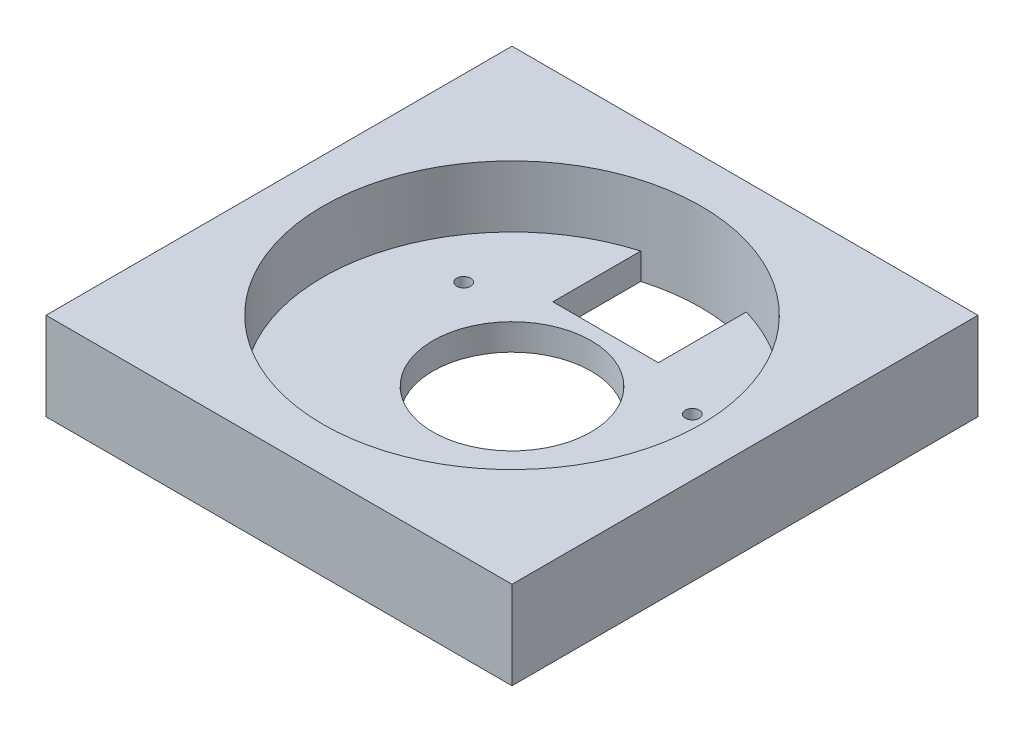
ISO-10303-21;
HEADER;
FILE_DESCRIPTION(('STEP AP214'),'2;1');
FILE_NAME('part.step','',(''),(''),'','','');
FILE_SCHEMA(('AUTOMOTIVE_DESIGN { 1 0 10303 214 1 1 1 1 }'));
ENDSEC;
DATA;
#1=APPLICATION_CONTEXT('core data for automotive mechanical design processes');
#2=APPLICATION_PROTOCOL_DEFINITION('international standard','automotive_design',2000,#1);
#3=PRODUCT_CONTEXT('',#1,'mechanical');
#4=PRODUCT('Part','Part','',(#3));
#5=PRODUCT_RELATED_PRODUCT_CATEGORY('part','',(#4));
#6=PRODUCT_DEFINITION_FORMATION('','',#4);
#7=PRODUCT_DEFINITION_CONTEXT('part definition',#1,'design');
#8=PRODUCT_DEFINITION('design','',#6,#7);
#9=PRODUCT_DEFINITION_SHAPE('','',#8);
#10=(LENGTH_UNIT() NAMED_UNIT(*) SI_UNIT(.MILLI.,.METRE.));
#11=(NAMED_UNIT(*) PLANE_ANGLE_UNIT() SI_UNIT($,.RADIAN.));
#12=(NAMED_UNIT(*) SI_UNIT($,.STERADIAN.) SOLID_ANGLE_UNIT());
#13=UNCERTAINTY_MEASURE_WITH_UNIT(LENGTH_MEASURE(1.E-05),#10,'distance_accuracy_value','');
#14=(GEOMETRIC_REPRESENTATION_CONTEXT(3) GLOBAL_UNCERTAINTY_ASSIGNED_CONTEXT((#13)) GLOBAL_UNIT_ASSIGNED_CONTEXT((#10,
#11,#12)) REPRESENTATION_CONTEXT('',''));
#15=CARTESIAN_POINT('',(0.,0.,0.));
#16=DIRECTION('',(0.,0.,1.));
#17=DIRECTION('',(1.,0.,0.));
#18=AXIS2_PLACEMENT_3D('',#15,#16,#17);
#19=CARTESIAN_POINT('',(0.,7.,0.));
#20=DIRECTION('',(0.,1.,0.));
#21=DIRECTION('',(0.,0.,1.));
#22=AXIS2_PLACEMENT_3D('',#19,#20,#21);
#23=PLANE('',#22);
#24=DIRECTION('',(0.,0.,-1.));
#25=VECTOR('',#24,1.);
#26=CARTESIAN_POINT('',(26.5,7.,-26.5));
#27=LINE('',#26,#25);
#28=CARTESIAN_POINT('',(26.5,7.,26.5));
#29=VERTEX_POINT('',#28);
#30=CARTESIAN_POINT('',(26.5,7.,-26.5));
#31=VERTEX_POINT('',#30);
#32=EDGE_CURVE('E205',#29,#31,#27,.T.);
#33=ORIENTED_EDGE('',*,*,#32,.T.);
#34=DIRECTION('',(-1.,0.,0.));
#35=VECTOR('',#34,1.);
#36=CARTESIAN_POINT('',(-26.5,7.,-26.5));
#37=LINE('',#36,#35);
#38=CARTESIAN_POINT('',(-26.5,7.,-26.5));
#39=VERTEX_POINT('',#38);
#40=EDGE_CURVE('E210',#31,#39,#37,.T.);
#41=ORIENTED_EDGE('',*,*,#40,.T.);
#42=DIRECTION('',(0.,0.,1.));
#43=VECTOR('',#42,1.);
#44=CARTESIAN_POINT('',(-26.5,7.,-26.5));
#45=LINE('',#44,#43);
#46=CARTESIAN_POINT('',(-26.5,7.,26.5));
#47=VERTEX_POINT('',#46);
#48=EDGE_CURVE('E213',#39,#47,#45,.T.);
#49=ORIENTED_EDGE('',*,*,#48,.T.);
#50=DIRECTION('',(1.,0.,0.));
#51=VECTOR('',#50,1.);
#52=CARTESIAN_POINT('',(-26.5,7.,26.5));
#53=LINE('',#52,#51);
#54=EDGE_CURVE('E63',#47,#29,#53,.T.);
#55=ORIENTED_EDGE('',*,*,#54,.T.);
#56=EDGE_LOOP('',(#33,#41,#49,#55));
#57=FACE_BOUND('',#56,.T.);
#58=CARTESIAN_POINT('',(0.,7.,0.));
#59=DIRECTION('',(0.,1.,0.));
#60=DIRECTION('',(0.,0.,1.));
#61=AXIS2_PLACEMENT_3D('',#58,#59,#60);
#62=CIRCLE('',#61,21.5);
#63=CARTESIAN_POINT('',(0.,7.,21.5));
#64=VERTEX_POINT('',#63);
#65=EDGE_CURVE('E201',#64,#64,#62,.T.);
#66=ORIENTED_EDGE('',*,*,#65,.F.);
#67=EDGE_LOOP('',(#66));
#68=FACE_BOUND('',#67,.T.);
#69=ADVANCED_FACE('F39',(#57,#68),#23,.T.);
#70=CARTESIAN_POINT('',(26.5,7.,-26.5));
#71=DIRECTION('',(-1.,0.,0.));
#72=DIRECTION('',(0.,0.,1.));
#73=AXIS2_PLACEMENT_3D('',#70,#71,#72);
#74=PLANE('',#73);
#75=DIRECTION('',(0.,-1.,0.));
#76=VECTOR('',#75,1.);
#77=CARTESIAN_POINT('',(26.5,7.,26.5));
#78=LINE('',#77,#76);
#79=CARTESIAN_POINT('',(26.5,-3.,26.5));
#80=VERTEX_POINT('',#79);
#81=EDGE_CURVE('E218',#29,#80,#78,.T.);
#82=ORIENTED_EDGE('',*,*,#81,.T.);
#83=DIRECTION('',(0.,0.,1.));
#84=VECTOR('',#83,1.);
#85=CARTESIAN_POINT('',(26.5,-3.,26.5));
#86=LINE('',#85,#84);
#87=CARTESIAN_POINT('',(26.5,-3.,-26.5));
#88=VERTEX_POINT('',#87);
#89=EDGE_CURVE('E193',#88,#80,#86,.T.);
#90=ORIENTED_EDGE('',*,*,#89,.F.);
#91=DIRECTION('',(0.,-1.,0.));
#92=VECTOR('',#91,1.);
#93=CARTESIAN_POINT('',(26.5,7.,-26.5));
#94=LINE('',#93,#92);
#95=EDGE_CURVE('E11',#31,#88,#94,.T.);
#96=ORIENTED_EDGE('',*,*,#95,.F.);
#97=ORIENTED_EDGE('',*,*,#32,.F.);
#98=EDGE_LOOP('',(#82,#90,#96,#97));
#99=FACE_BOUND('',#98,.T.);
#100=ADVANCED_FACE('F41',(#99),#74,.F.);
#101=CARTESIAN_POINT('',(-26.5,7.,-26.5));
#102=DIRECTION('',(0.,0.,1.));
#103=DIRECTION('',(1.,0.,0.));
#104=AXIS2_PLACEMENT_3D('',#101,#102,#103);
#105=PLANE('',#104);
#106=ORIENTED_EDGE('',*,*,#95,.T.);
#107=DIRECTION('',(1.,0.,0.));
#108=VECTOR('',#107,1.);
#109=CARTESIAN_POINT('',(-26.5,-3.,-26.5));
#110=LINE('',#109,#108);
#111=CARTESIAN_POINT('',(-26.5,-3.,-26.5));
#112=VERTEX_POINT('',#111);
#113=EDGE_CURVE('E189',#112,#88,#110,.T.);
#114=ORIENTED_EDGE('',*,*,#113,.F.);
#115=DIRECTION('',(0.,-1.,0.));
#116=VECTOR('',#115,1.);
#117=CARTESIAN_POINT('',(-26.5,7.,-26.5));
#118=LINE('',#117,#116);
#119=EDGE_CURVE('E48',#39,#112,#118,.T.);
#120=ORIENTED_EDGE('',*,*,#119,.F.);
#121=ORIENTED_EDGE('',*,*,#40,.F.);
#122=EDGE_LOOP('',(#106,#114,#120,#121));
#123=FACE_BOUND('',#122,.T.);
#124=ADVANCED_FACE('F232',(#123),#105,.F.);
#125=CARTESIAN_POINT('',(-26.5,7.,-26.5));
#126=DIRECTION('',(1.,0.,0.));
#127=DIRECTION('',(0.,0.,-1.));
#128=AXIS2_PLACEMENT_3D('',#125,#126,#127);
#129=PLANE('',#128);
#130=ORIENTED_EDGE('',*,*,#119,.T.);
#131=DIRECTION('',(0.,0.,-1.));
#132=VECTOR('',#131,1.);
#133=CARTESIAN_POINT('',(-26.5,-3.,26.5));
#134=LINE('',#133,#132);
#135=CARTESIAN_POINT('',(-26.5,-3.,26.5));
#136=VERTEX_POINT('',#135);
#137=EDGE_CURVE('E182',#136,#112,#134,.T.);
#138=ORIENTED_EDGE('',*,*,#137,.F.);
#139=DIRECTION('',(0.,-1.,0.));
#140=VECTOR('',#139,1.);
#141=CARTESIAN_POINT('',(-26.5,7.,26.5));
#142=LINE('',#141,#140);
#143=EDGE_CURVE('E221',#47,#136,#142,.T.);
#144=ORIENTED_EDGE('',*,*,#143,.F.);
#145=ORIENTED_EDGE('',*,*,#48,.F.);
#146=EDGE_LOOP('',(#130,#138,#144,#145));
#147=FACE_BOUND('',#146,.T.);
#148=ADVANCED_FACE('F229',(#147),#129,.F.);
#149=CARTESIAN_POINT('',(-26.5,7.,26.5));
#150=DIRECTION('',(0.,0.,-1.));
#151=DIRECTION('',(-1.,0.,0.));
#152=AXIS2_PLACEMENT_3D('',#149,#150,#151);
#153=PLANE('',#152);
#154=ORIENTED_EDGE('',*,*,#143,.T.);
#155=DIRECTION('',(-1.,0.,0.));
#156=VECTOR('',#155,1.);
#157=CARTESIAN_POINT('',(-26.5,-3.,26.5));
#158=LINE('',#157,#156);
#159=EDGE_CURVE('E197',#80,#136,#158,.T.);
#160=ORIENTED_EDGE('',*,*,#159,.F.);
#161=ORIENTED_EDGE('',*,*,#81,.F.);
#162=ORIENTED_EDGE('',*,*,#54,.F.);
#163=EDGE_LOOP('',(#154,#160,#161,#162));
#164=FACE_BOUND('',#163,.T.);
#165=ADVANCED_FACE('F239',(#164),#153,.F.);
#166=CARTESIAN_POINT('',(0.,7.,0.));
#167=DIRECTION('',(0.,-1.,0.));
#168=DIRECTION('',(0.,0.,-1.));
#169=AXIS2_PLACEMENT_3D('',#166,#167,#168);
#170=CYLINDRICAL_SURFACE('',#169,21.5);
#171=ORIENTED_EDGE('',*,*,#65,.T.);
#172=EDGE_LOOP('',(#171));
#173=FACE_BOUND('',#172,.T.);
#174=CARTESIAN_POINT('',(0.,0.,0.));
#175=DIRECTION('',(0.,1.,0.));
#176=DIRECTION('',(0.,0.,1.));
#177=AXIS2_PLACEMENT_3D('',#174,#175,#176);
#178=CIRCLE('',#177,21.5);
#179=CARTESIAN_POINT('',(-6.,0.,-20.6458228220626));
#180=VERTEX_POINT('',#179);
#181=CARTESIAN_POINT('',(6.,0.,-20.6458228220626));
#182=VERTEX_POINT('',#181);
#183=EDGE_CURVE('E55',#180,#182,#178,.T.);
#184=ORIENTED_EDGE('',*,*,#183,.F.);
#185=DIRECTION('',(0.,1.,0.));
#186=VECTOR('',#185,1.);
#187=CARTESIAN_POINT('',(-6.,-3.,-20.6458228220626));
#188=LINE('',#187,#186);
#189=CARTESIAN_POINT('',(-6.,-3.,-20.6458228220626));
#190=VERTEX_POINT('',#189);
#191=EDGE_CURVE('E108',#190,#180,#188,.T.);
#192=ORIENTED_EDGE('',*,*,#191,.F.);
#193=CARTESIAN_POINT('',(0.,-3.,0.));
#194=DIRECTION('',(0.,-1.,0.));
#195=DIRECTION('',(0.,0.,-1.));
#196=AXIS2_PLACEMENT_3D('',#193,#194,#195);
#197=CIRCLE('',#196,21.5);
#198=CARTESIAN_POINT('',(6.,-3.,-20.6458228220626));
#199=VERTEX_POINT('',#198);
#200=EDGE_CURVE('E104',#190,#199,#197,.T.);
#201=ORIENTED_EDGE('',*,*,#200,.T.);
#202=DIRECTION('',(0.,1.,0.));
#203=VECTOR('',#202,1.);
#204=CARTESIAN_POINT('',(6.,-3.,-20.6458228220626));
#205=LINE('',#204,#203);
#206=EDGE_CURVE('E107',#199,#182,#205,.T.);
#207=ORIENTED_EDGE('',*,*,#206,.T.);
#208=EDGE_LOOP('',(#184,#192,#201,#207));
#209=FACE_BOUND('',#208,.T.);
#210=ADVANCED_FACE('F106',(#173,#209),#170,.F.);
#211=CARTESIAN_POINT('',(0.,0.,0.));
#212=DIRECTION('',(0.,-1.,0.));
#213=DIRECTION('',(0.,0.,-1.));
#214=AXIS2_PLACEMENT_3D('',#211,#212,#213);
#215=PLANE('',#214);
#216=CARTESIAN_POINT('',(-13.,0.,-7.50555349946513));
#217=DIRECTION('',(0.,-1.,0.));
#218=DIRECTION('',(0.,0.,-1.));
#219=AXIS2_PLACEMENT_3D('',#216,#217,#218);
#220=CIRCLE('',#219,0.800000000000001);
#221=CARTESIAN_POINT('',(-13.,0.,-8.30555349946513));
#222=VERTEX_POINT('',#221);
#223=EDGE_CURVE('E174',#222,#222,#220,.T.);
#224=ORIENTED_EDGE('',*,*,#223,.T.);
#225=EDGE_LOOP('',(#224));
#226=FACE_BOUND('',#225,.T.);
#227=CARTESIAN_POINT('',(0.,0.,0.));
#228=DIRECTION('',(0.,-1.,0.));
#229=DIRECTION('',(0.,0.,-1.));
#230=AXIS2_PLACEMENT_3D('',#227,#228,#229);
#231=CIRCLE('',#230,9.);
#232=CARTESIAN_POINT('',(0.,0.,-9.));
#233=VERTEX_POINT('',#232);
#234=EDGE_CURVE('E166',#233,#233,#231,.T.);
#235=ORIENTED_EDGE('',*,*,#234,.T.);
#236=EDGE_LOOP('',(#235));
#237=FACE_BOUND('',#236,.T.);
#238=CARTESIAN_POINT('',(0.,0.,15.0111069989303));
#239=DIRECTION('',(0.,-1.,0.));
#240=DIRECTION('',(0.,0.,-1.));
#241=AXIS2_PLACEMENT_3D('',#238,#239,#240);
#242=CIRCLE('',#241,0.800000000000003);
#243=CARTESIAN_POINT('',(0.,0.,14.2111069989303));
#244=VERTEX_POINT('',#243);
#245=EDGE_CURVE('E158',#244,#244,#242,.T.);
#246=ORIENTED_EDGE('',*,*,#245,.T.);
#247=EDGE_LOOP('',(#246));
#248=FACE_BOUND('',#247,.T.);
#249=CARTESIAN_POINT('',(13.,0.,-7.50555349946512));
#250=DIRECTION('',(0.,-1.,0.));
#251=DIRECTION('',(0.,0.,-1.));
#252=AXIS2_PLACEMENT_3D('',#249,#250,#251);
#253=CIRCLE('',#252,0.800000000000001);
#254=CARTESIAN_POINT('',(13.,0.,-8.30555349946513));
#255=VERTEX_POINT('',#254);
#256=EDGE_CURVE('E123',#255,#255,#253,.T.);
#257=ORIENTED_EDGE('',*,*,#256,.T.);
#258=EDGE_LOOP('',(#257));
#259=FACE_BOUND('',#258,.T.);
#260=DIRECTION('',(0.,0.,-1.));
#261=VECTOR('',#260,1.);
#262=CARTESIAN_POINT('',(-6.,0.,-20.6458228220626));
#263=LINE('',#262,#261);
#264=CARTESIAN_POINT('',(-6.,0.,-10.6458228220626));
#265=VERTEX_POINT('',#264);
#266=EDGE_CURVE('E114',#265,#180,#263,.T.);
#267=ORIENTED_EDGE('',*,*,#266,.T.);
#268=ORIENTED_EDGE('',*,*,#183,.T.);
#269=DIRECTION('',(0.,0.,1.));
#270=VECTOR('',#269,1.);
#271=CARTESIAN_POINT('',(6.,0.,-10.6458228220626));
#272=LINE('',#271,#270);
#273=CARTESIAN_POINT('',(6.,0.,-10.6458228220626));
#274=VERTEX_POINT('',#273);
#275=EDGE_CURVE('E121',#182,#274,#272,.T.);
#276=ORIENTED_EDGE('',*,*,#275,.T.);
#277=DIRECTION('',(-1.,0.,0.));
#278=VECTOR('',#277,1.);
#279=CARTESIAN_POINT('',(-6.,0.,-10.6458228220626));
#280=LINE('',#279,#278);
#281=EDGE_CURVE('E140',#274,#265,#280,.T.);
#282=ORIENTED_EDGE('',*,*,#281,.T.);
#283=EDGE_LOOP('',(#267,#268,#276,#282));
#284=FACE_BOUND('',#283,.T.);
#285=ADVANCED_FACE('F248',(#226,#237,#248,#259,#284),#215,.F.);
#286=CARTESIAN_POINT('',(0.,-3.,0.));
#287=DIRECTION('',(0.,-1.,0.));
#288=DIRECTION('',(0.,0.,-1.));
#289=AXIS2_PLACEMENT_3D('',#286,#287,#288);
#290=PLANE('',#289);
#291=CARTESIAN_POINT('',(0.,-3.,15.0111069989303));
#292=DIRECTION('',(0.,-1.,0.));
#293=DIRECTION('',(0.,0.,-1.));
#294=AXIS2_PLACEMENT_3D('',#291,#292,#293);
#295=CIRCLE('',#294,0.800000000000003);
#296=CARTESIAN_POINT('',(0.,-3.,14.2111069989303));
#297=VERTEX_POINT('',#296);
#298=EDGE_CURVE('E162',#297,#297,#295,.T.);
#299=ORIENTED_EDGE('',*,*,#298,.F.);
#300=EDGE_LOOP('',(#299));
#301=FACE_BOUND('',#300,.T.);
#302=CARTESIAN_POINT('',(-13.,-3.,-7.50555349946513));
#303=DIRECTION('',(0.,-1.,0.));
#304=DIRECTION('',(0.,0.,-1.));
#305=AXIS2_PLACEMENT_3D('',#302,#303,#304);
#306=CIRCLE('',#305,0.800000000000001);
#307=CARTESIAN_POINT('',(-13.,-3.,-8.30555349946513));
#308=VERTEX_POINT('',#307);
#309=EDGE_CURVE('E178',#308,#308,#306,.T.);
#310=ORIENTED_EDGE('',*,*,#309,.F.);
#311=EDGE_LOOP('',(#310));
#312=FACE_BOUND('',#311,.T.);
#313=ORIENTED_EDGE('',*,*,#137,.T.);
#314=ORIENTED_EDGE('',*,*,#113,.T.);
#315=ORIENTED_EDGE('',*,*,#89,.T.);
#316=ORIENTED_EDGE('',*,*,#159,.T.);
#317=EDGE_LOOP('',(#313,#314,#315,#316));
#318=FACE_BOUND('',#317,.T.);
#319=CARTESIAN_POINT('',(0.,-3.,0.));
#320=DIRECTION('',(0.,-1.,0.));
#321=DIRECTION('',(0.,0.,-1.));
#322=AXIS2_PLACEMENT_3D('',#319,#320,#321);
#323=CIRCLE('',#322,9.);
#324=CARTESIAN_POINT('',(0.,-3.,-9.));
#325=VERTEX_POINT('',#324);
#326=EDGE_CURVE('E170',#325,#325,#323,.T.);
#327=ORIENTED_EDGE('',*,*,#326,.F.);
#328=EDGE_LOOP('',(#327));
#329=FACE_BOUND('',#328,.T.);
#330=CARTESIAN_POINT('',(13.,-3.,-7.50555349946512));
#331=DIRECTION('',(0.,-1.,0.));
#332=DIRECTION('',(0.,0.,-1.));
#333=AXIS2_PLACEMENT_3D('',#330,#331,#332);
#334=CIRCLE('',#333,0.800000000000001);
#335=CARTESIAN_POINT('',(13.,-3.,-8.30555349946513));
#336=VERTEX_POINT('',#335);
#337=EDGE_CURVE('E154',#336,#336,#334,.T.);
#338=ORIENTED_EDGE('',*,*,#337,.F.);
#339=EDGE_LOOP('',(#338));
#340=FACE_BOUND('',#339,.T.);
#341=DIRECTION('',(0.,0.,1.));
#342=VECTOR('',#341,1.);
#343=CARTESIAN_POINT('',(6.,-3.,-10.6458228220626));
#344=LINE('',#343,#342);
#345=CARTESIAN_POINT('',(6.,-3.,-10.6458228220626));
#346=VERTEX_POINT('',#345);
#347=EDGE_CURVE('E113',#199,#346,#344,.T.);
#348=ORIENTED_EDGE('',*,*,#347,.F.);
#349=ORIENTED_EDGE('',*,*,#200,.F.);
#350=DIRECTION('',(0.,0.,-1.));
#351=VECTOR('',#350,1.);
#352=CARTESIAN_POINT('',(-6.,-3.,-20.6458228220626));
#353=LINE('',#352,#351);
#354=CARTESIAN_POINT('',(-6.,-3.,-10.6458228220626));
#355=VERTEX_POINT('',#354);
#356=EDGE_CURVE('E133',#355,#190,#353,.T.);
#357=ORIENTED_EDGE('',*,*,#356,.F.);
#358=DIRECTION('',(-1.,0.,0.));
#359=VECTOR('',#358,1.);
#360=CARTESIAN_POINT('',(-6.,-3.,-10.6458228220626));
#361=LINE('',#360,#359);
#362=EDGE_CURVE('E129',#346,#355,#361,.T.);
#363=ORIENTED_EDGE('',*,*,#362,.F.);
#364=EDGE_LOOP('',(#348,#349,#357,#363));
#365=FACE_BOUND('',#364,.T.);
#366=ADVANCED_FACE('F127',(#301,#312,#318,#329,#340,#365),#290,.T.);
#367=CARTESIAN_POINT('',(-13.,-3.,-7.50555349946513));
#368=DIRECTION('',(0.,1.,0.));
#369=DIRECTION('',(0.,0.,1.));
#370=AXIS2_PLACEMENT_3D('',#367,#368,#369);
#371=CYLINDRICAL_SURFACE('',#370,0.800000000000001);
#372=ORIENTED_EDGE('',*,*,#309,.T.);
#373=EDGE_LOOP('',(#372));
#374=FACE_BOUND('',#373,.T.);
#375=ORIENTED_EDGE('',*,*,#223,.F.);
#376=EDGE_LOOP('',(#375));
#377=FACE_BOUND('',#376,.T.);
#378=ADVANCED_FACE('F317',(#374,#377),#371,.F.);
#379=CARTESIAN_POINT('',(0.,-3.,0.));
#380=DIRECTION('',(0.,1.,0.));
#381=DIRECTION('',(0.,0.,1.));
#382=AXIS2_PLACEMENT_3D('',#379,#380,#381);
#383=CYLINDRICAL_SURFACE('',#382,9.);
#384=ORIENTED_EDGE('',*,*,#326,.T.);
#385=EDGE_LOOP('',(#384));
#386=FACE_BOUND('',#385,.T.);
#387=ORIENTED_EDGE('',*,*,#234,.F.);
#388=EDGE_LOOP('',(#387));
#389=FACE_BOUND('',#388,.T.);
#390=ADVANCED_FACE('F325',(#386,#389),#383,.F.);
#391=CARTESIAN_POINT('',(0.,-3.,15.0111069989303));
#392=DIRECTION('',(0.,1.,0.));
#393=DIRECTION('',(0.,0.,1.));
#394=AXIS2_PLACEMENT_3D('',#391,#392,#393);
#395=CYLINDRICAL_SURFACE('',#394,0.800000000000003);
#396=ORIENTED_EDGE('',*,*,#298,.T.);
#397=EDGE_LOOP('',(#396));
#398=FACE_BOUND('',#397,.T.);
#399=ORIENTED_EDGE('',*,*,#245,.F.);
#400=EDGE_LOOP('',(#399));
#401=FACE_BOUND('',#400,.T.);
#402=ADVANCED_FACE('F334',(#398,#401),#395,.F.);
#403=CARTESIAN_POINT('',(13.,-3.,-7.50555349946512));
#404=DIRECTION('',(0.,1.,0.));
#405=DIRECTION('',(0.,0.,1.));
#406=AXIS2_PLACEMENT_3D('',#403,#404,#405);
#407=CYLINDRICAL_SURFACE('',#406,0.800000000000001);
#408=ORIENTED_EDGE('',*,*,#337,.T.);
#409=EDGE_LOOP('',(#408));
#410=FACE_BOUND('',#409,.T.);
#411=ORIENTED_EDGE('',*,*,#256,.F.);
#412=EDGE_LOOP('',(#411));
#413=FACE_BOUND('',#412,.T.);
#414=ADVANCED_FACE('F343',(#410,#413),#407,.F.);
#415=CARTESIAN_POINT('',(6.,-3.,-10.6458228220626));
#416=DIRECTION('',(-1.,0.,0.));
#417=DIRECTION('',(0.,0.,1.));
#418=AXIS2_PLACEMENT_3D('',#415,#416,#417);
#419=PLANE('',#418);
#420=ORIENTED_EDGE('',*,*,#275,.F.);
#421=ORIENTED_EDGE('',*,*,#206,.F.);
#422=ORIENTED_EDGE('',*,*,#347,.T.);
#423=DIRECTION('',(0.,1.,0.));
#424=VECTOR('',#423,1.);
#425=CARTESIAN_POINT('',(6.,-3.,-10.6458228220626));
#426=LINE('',#425,#424);
#427=EDGE_CURVE('E124',#346,#274,#426,.T.);
#428=ORIENTED_EDGE('',*,*,#427,.T.);
#429=EDGE_LOOP('',(#420,#421,#422,#428));
#430=FACE_BOUND('',#429,.T.);
#431=ADVANCED_FACE('F118',(#430),#419,.T.);
#432=CARTESIAN_POINT('',(-6.,-3.,-10.6458228220626));
#433=DIRECTION('',(0.,0.,-1.));
#434=DIRECTION('',(-1.,0.,0.));
#435=AXIS2_PLACEMENT_3D('',#432,#433,#434);
#436=PLANE('',#435);
#437=ORIENTED_EDGE('',*,*,#281,.F.);
#438=ORIENTED_EDGE('',*,*,#427,.F.);
#439=ORIENTED_EDGE('',*,*,#362,.T.);
#440=DIRECTION('',(0.,1.,0.));
#441=VECTOR('',#440,1.);
#442=CARTESIAN_POINT('',(-6.,-3.,-10.6458228220626));
#443=LINE('',#442,#441);
#444=EDGE_CURVE('E149',#355,#265,#443,.T.);
#445=ORIENTED_EDGE('',*,*,#444,.T.);
#446=EDGE_LOOP('',(#437,#438,#439,#445));
#447=FACE_BOUND('',#446,.T.);
#448=ADVANCED_FACE('F360',(#447),#436,.T.);
#449=CARTESIAN_POINT('',(-6.,-3.,-20.6458228220626));
#450=DIRECTION('',(1.,0.,0.));
#451=DIRECTION('',(0.,0.,-1.));
#452=AXIS2_PLACEMENT_3D('',#449,#450,#451);
#453=PLANE('',#452);
#454=ORIENTED_EDGE('',*,*,#266,.F.);
#455=ORIENTED_EDGE('',*,*,#444,.F.);
#456=ORIENTED_EDGE('',*,*,#356,.T.);
#457=ORIENTED_EDGE('',*,*,#191,.T.);
#458=EDGE_LOOP('',(#454,#455,#456,#457));
#459=FACE_BOUND('',#458,.T.);
#460=ADVANCED_FACE('F368',(#459),#453,.T.);
#461=CLOSED_SHELL('',(#69,#100,#124,#148,#165,#210,#285,#366,#378,#390,#402,#414,#431,#448,#460));
#462=MANIFOLD_SOLID_BREP('B2',#461);
#463=ADVANCED_BREP_SHAPE_REPRESENTATION('',(#18,#462),#14);
#464=SHAPE_DEFINITION_REPRESENTATION(#9,#463);
ENDSEC;
END-ISO-10303-21;
